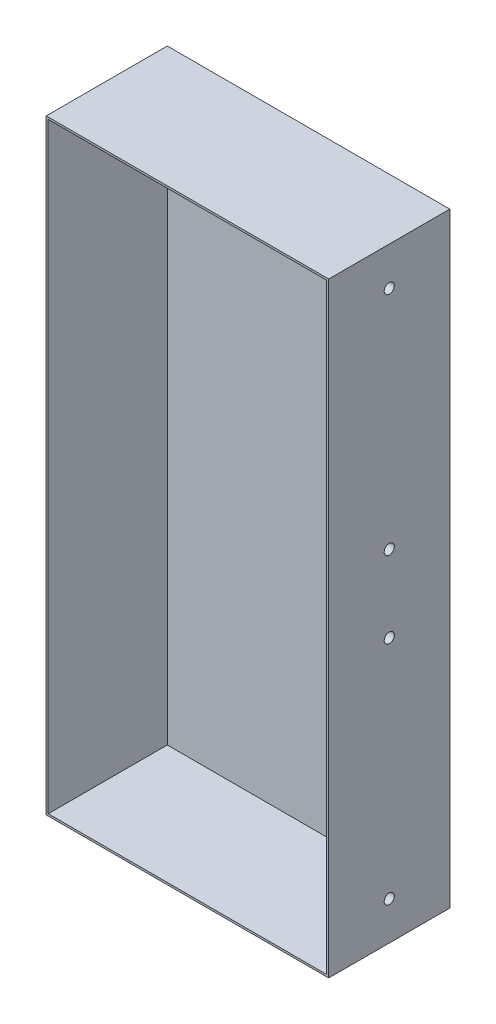
ISO-10303-21;
HEADER;
FILE_DESCRIPTION(('STEP AP214'),'2;1');
FILE_NAME('part.step','',(''),(''),'','','');
FILE_SCHEMA(('AUTOMOTIVE_DESIGN { 1 0 10303 214 1 1 1 1 }'));
ENDSEC;
DATA;
#1=APPLICATION_CONTEXT('core data for automotive mechanical design processes');
#2=APPLICATION_PROTOCOL_DEFINITION('international standard','automotive_design',2000,#1);
#3=PRODUCT_CONTEXT('',#1,'mechanical');
#4=PRODUCT('Part','Part','',(#3));
#5=PRODUCT_RELATED_PRODUCT_CATEGORY('part','',(#4));
#6=PRODUCT_DEFINITION_FORMATION('','',#4);
#7=PRODUCT_DEFINITION_CONTEXT('part definition',#1,'design');
#8=PRODUCT_DEFINITION('design','',#6,#7);
#9=PRODUCT_DEFINITION_SHAPE('','',#8);
#10=(LENGTH_UNIT() NAMED_UNIT(*) SI_UNIT(.MILLI.,.METRE.));
#11=(NAMED_UNIT(*) PLANE_ANGLE_UNIT() SI_UNIT($,.RADIAN.));
#12=(NAMED_UNIT(*) SI_UNIT($,.STERADIAN.) SOLID_ANGLE_UNIT());
#13=UNCERTAINTY_MEASURE_WITH_UNIT(LENGTH_MEASURE(1.E-05),#10,'distance_accuracy_value','');
#14=(GEOMETRIC_REPRESENTATION_CONTEXT(3) GLOBAL_UNCERTAINTY_ASSIGNED_CONTEXT((#13)) GLOBAL_UNIT_ASSIGNED_CONTEXT((#10,
#11,#12)) REPRESENTATION_CONTEXT('',''));
#15=CARTESIAN_POINT('',(0.,0.,0.));
#16=DIRECTION('',(0.,0.,1.));
#17=DIRECTION('',(1.,0.,0.));
#18=AXIS2_PLACEMENT_3D('',#15,#16,#17);
#19=CARTESIAN_POINT('',(0.,0.,150.));
#20=DIRECTION('',(0.,0.,-1.));
#21=DIRECTION('',(-1.,0.,0.));
#22=AXIS2_PLACEMENT_3D('',#19,#20,#21);
#23=PLANE('',#22);
#24=DIRECTION('',(-1.,0.,0.));
#25=VECTOR('',#24,1.);
#26=CARTESIAN_POINT('',(-350.,750.,150.));
#27=LINE('',#26,#25);
#28=CARTESIAN_POINT('',(350.,750.,150.));
#29=VERTEX_POINT('',#28);
#30=CARTESIAN_POINT('',(-350.,750.,150.));
#31=VERTEX_POINT('',#30);
#32=EDGE_CURVE('E183',#29,#31,#27,.T.);
#33=ORIENTED_EDGE('',*,*,#32,.T.);
#34=DIRECTION('',(0.,-1.,0.));
#35=VECTOR('',#34,1.);
#36=CARTESIAN_POINT('',(-350.,750.,150.));
#37=LINE('',#36,#35);
#38=CARTESIAN_POINT('',(-350.,-750.,150.));
#39=VERTEX_POINT('',#38);
#40=EDGE_CURVE('E185',#31,#39,#37,.T.);
#41=ORIENTED_EDGE('',*,*,#40,.T.);
#42=DIRECTION('',(1.,0.,0.));
#43=VECTOR('',#42,1.);
#44=CARTESIAN_POINT('',(-350.,-750.,150.));
#45=LINE('',#44,#43);
#46=CARTESIAN_POINT('',(350.,-750.,150.));
#47=VERTEX_POINT('',#46);
#48=EDGE_CURVE('E187',#39,#47,#45,.T.);
#49=ORIENTED_EDGE('',*,*,#48,.T.);
#50=DIRECTION('',(0.,1.,0.));
#51=VECTOR('',#50,1.);
#52=CARTESIAN_POINT('',(350.,750.,150.));
#53=LINE('',#52,#51);
#54=EDGE_CURVE('E55',#47,#29,#53,.T.);
#55=ORIENTED_EDGE('',*,*,#54,.T.);
#56=EDGE_LOOP('',(#33,#41,#49,#55));
#57=FACE_BOUND('',#56,.T.);
#58=DIRECTION('',(-1.,0.,0.));
#59=VECTOR('',#58,1.);
#60=CARTESIAN_POINT('',(0.,745.,150.));
#61=LINE('',#60,#59);
#62=CARTESIAN_POINT('',(345.,745.,150.));
#63=VERTEX_POINT('',#62);
#64=CARTESIAN_POINT('',(-345.,745.,150.));
#65=VERTEX_POINT('',#64);
#66=EDGE_CURVE('E120',#63,#65,#61,.T.);
#67=ORIENTED_EDGE('',*,*,#66,.F.);
#68=DIRECTION('',(0.,1.,0.));
#69=VECTOR('',#68,1.);
#70=CARTESIAN_POINT('',(345.,0.,150.));
#71=LINE('',#70,#69);
#72=CARTESIAN_POINT('',(345.,-745.,150.));
#73=VERTEX_POINT('',#72);
#74=EDGE_CURVE('E101',#73,#63,#71,.T.);
#75=ORIENTED_EDGE('',*,*,#74,.F.);
#76=DIRECTION('',(1.,0.,0.));
#77=VECTOR('',#76,1.);
#78=CARTESIAN_POINT('',(0.,-745.,150.));
#79=LINE('',#78,#77);
#80=CARTESIAN_POINT('',(-345.,-745.,150.));
#81=VERTEX_POINT('',#80);
#82=EDGE_CURVE('E130',#81,#73,#79,.T.);
#83=ORIENTED_EDGE('',*,*,#82,.F.);
#84=DIRECTION('',(0.,-1.,0.));
#85=VECTOR('',#84,1.);
#86=CARTESIAN_POINT('',(-345.,0.,150.));
#87=LINE('',#86,#85);
#88=EDGE_CURVE('E122',#65,#81,#87,.T.);
#89=ORIENTED_EDGE('',*,*,#88,.F.);
#90=EDGE_LOOP('',(#67,#75,#83,#89));
#91=FACE_BOUND('',#90,.T.);
#92=ADVANCED_FACE('F32',(#57,#91),#23,.F.);
#93=CARTESIAN_POINT('',(-350.,750.,150.));
#94=DIRECTION('',(0.,-1.,0.));
#95=DIRECTION('',(0.,0.,-1.));
#96=AXIS2_PLACEMENT_3D('',#93,#94,#95);
#97=PLANE('',#96);
#98=DIRECTION('',(0.,0.,-1.));
#99=VECTOR('',#98,1.);
#100=CARTESIAN_POINT('',(350.,750.,150.));
#101=LINE('',#100,#99);
#102=CARTESIAN_POINT('',(350.,750.,-150.));
#103=VERTEX_POINT('',#102);
#104=EDGE_CURVE('E190',#29,#103,#101,.T.);
#105=ORIENTED_EDGE('',*,*,#104,.T.);
#106=DIRECTION('',(-1.,0.,0.));
#107=VECTOR('',#106,1.);
#108=CARTESIAN_POINT('',(-350.,750.,-150.));
#109=LINE('',#108,#107);
#110=CARTESIAN_POINT('',(-350.,750.,-150.));
#111=VERTEX_POINT('',#110);
#112=EDGE_CURVE('E167',#103,#111,#109,.T.);
#113=ORIENTED_EDGE('',*,*,#112,.T.);
#114=DIRECTION('',(0.,0.,-1.));
#115=VECTOR('',#114,1.);
#116=CARTESIAN_POINT('',(-350.,750.,150.));
#117=LINE('',#116,#115);
#118=EDGE_CURVE('E11',#31,#111,#117,.T.);
#119=ORIENTED_EDGE('',*,*,#118,.F.);
#120=ORIENTED_EDGE('',*,*,#32,.F.);
#121=EDGE_LOOP('',(#105,#113,#119,#120));
#122=FACE_BOUND('',#121,.T.);
#123=ADVANCED_FACE('F34',(#122),#97,.F.);
#124=CARTESIAN_POINT('',(-350.,750.,150.));
#125=DIRECTION('',(1.,0.,0.));
#126=DIRECTION('',(0.,1.,0.));
#127=AXIS2_PLACEMENT_3D('',#124,#125,#126);
#128=PLANE('',#127);
#129=ORIENTED_EDGE('',*,*,#118,.T.);
#130=DIRECTION('',(0.,-1.,0.));
#131=VECTOR('',#130,1.);
#132=CARTESIAN_POINT('',(-350.,750.,-150.));
#133=LINE('',#132,#131);
#134=CARTESIAN_POINT('',(-350.,-750.,-150.));
#135=VERTEX_POINT('',#134);
#136=EDGE_CURVE('E174',#111,#135,#133,.T.);
#137=ORIENTED_EDGE('',*,*,#136,.T.);
#138=DIRECTION('',(0.,0.,-1.));
#139=VECTOR('',#138,1.);
#140=CARTESIAN_POINT('',(-350.,-750.,150.));
#141=LINE('',#140,#139);
#142=EDGE_CURVE('E40',#39,#135,#141,.T.);
#143=ORIENTED_EDGE('',*,*,#142,.F.);
#144=ORIENTED_EDGE('',*,*,#40,.F.);
#145=EDGE_LOOP('',(#129,#137,#143,#144));
#146=FACE_BOUND('',#145,.T.);
#147=ADVANCED_FACE('F205',(#146),#128,.F.);
#148=CARTESIAN_POINT('',(-350.,-750.,150.));
#149=DIRECTION('',(0.,1.,0.));
#150=DIRECTION('',(0.,0.,1.));
#151=AXIS2_PLACEMENT_3D('',#148,#149,#150);
#152=PLANE('',#151);
#153=ORIENTED_EDGE('',*,*,#142,.T.);
#154=DIRECTION('',(1.,0.,0.));
#155=VECTOR('',#154,1.);
#156=CARTESIAN_POINT('',(-350.,-750.,-150.));
#157=LINE('',#156,#155);
#158=CARTESIAN_POINT('',(350.,-750.,-150.));
#159=VERTEX_POINT('',#158);
#160=EDGE_CURVE('E177',#135,#159,#157,.T.);
#161=ORIENTED_EDGE('',*,*,#160,.T.);
#162=DIRECTION('',(0.,0.,-1.));
#163=VECTOR('',#162,1.);
#164=CARTESIAN_POINT('',(350.,-750.,150.));
#165=LINE('',#164,#163);
#166=EDGE_CURVE('E192',#47,#159,#165,.T.);
#167=ORIENTED_EDGE('',*,*,#166,.F.);
#168=ORIENTED_EDGE('',*,*,#48,.F.);
#169=EDGE_LOOP('',(#153,#161,#167,#168));
#170=FACE_BOUND('',#169,.T.);
#171=ADVANCED_FACE('F197',(#170),#152,.F.);
#172=CARTESIAN_POINT('',(350.,750.,150.));
#173=DIRECTION('',(-1.,0.,0.));
#174=DIRECTION('',(0.,-1.,0.));
#175=AXIS2_PLACEMENT_3D('',#172,#173,#174);
#176=PLANE('',#175);
#177=CARTESIAN_POINT('',(350.,-655.,0.));
#178=DIRECTION('',(-1.,0.,0.));
#179=DIRECTION('',(0.,-1.,0.));
#180=AXIS2_PLACEMENT_3D('',#177,#178,#179);
#181=CIRCLE('',#180,12.5);
#182=CARTESIAN_POINT('',(350.,-667.5,0.));
#183=VERTEX_POINT('',#182);
#184=EDGE_CURVE('E151',#183,#183,#181,.T.);
#185=ORIENTED_EDGE('',*,*,#184,.T.);
#186=EDGE_LOOP('',(#185));
#187=FACE_BOUND('',#186,.T.);
#188=CARTESIAN_POINT('',(350.,-95.0000000000002,-5.83139853888034E-12));
#189=DIRECTION('',(-1.,0.,0.));
#190=DIRECTION('',(0.,-1.,0.));
#191=AXIS2_PLACEMENT_3D('',#188,#189,#190);
#192=CIRCLE('',#191,12.5);
#193=CARTESIAN_POINT('',(350.,-107.5,-5.83139853888034E-12));
#194=VERTEX_POINT('',#193);
#195=EDGE_CURVE('E155',#194,#194,#192,.T.);
#196=ORIENTED_EDGE('',*,*,#195,.T.);
#197=EDGE_LOOP('',(#196));
#198=FACE_BOUND('',#197,.T.);
#199=CARTESIAN_POINT('',(350.,655.,0.));
#200=DIRECTION('',(1.,0.,0.));
#201=DIRECTION('',(0.,1.,0.));
#202=AXIS2_PLACEMENT_3D('',#199,#200,#201);
#203=CIRCLE('',#202,12.5);
#204=CARTESIAN_POINT('',(350.,667.5,0.));
#205=VERTEX_POINT('',#204);
#206=EDGE_CURVE('E164',#205,#205,#203,.T.);
#207=ORIENTED_EDGE('',*,*,#206,.F.);
#208=EDGE_LOOP('',(#207));
#209=FACE_BOUND('',#208,.T.);
#210=CARTESIAN_POINT('',(350.,95.0000000000002,-5.83139853888034E-12));
#211=DIRECTION('',(1.,0.,0.));
#212=DIRECTION('',(0.,1.,0.));
#213=AXIS2_PLACEMENT_3D('',#210,#211,#212);
#214=CIRCLE('',#213,12.5);
#215=CARTESIAN_POINT('',(350.,107.5,-5.83139853888034E-12));
#216=VERTEX_POINT('',#215);
#217=EDGE_CURVE('E154',#216,#216,#214,.T.);
#218=ORIENTED_EDGE('',*,*,#217,.F.);
#219=EDGE_LOOP('',(#218));
#220=FACE_BOUND('',#219,.T.);
#221=ORIENTED_EDGE('',*,*,#166,.T.);
#222=DIRECTION('',(0.,1.,0.));
#223=VECTOR('',#222,1.);
#224=CARTESIAN_POINT('',(350.,750.,-150.));
#225=LINE('',#224,#223);
#226=EDGE_CURVE('E180',#159,#103,#225,.T.);
#227=ORIENTED_EDGE('',*,*,#226,.T.);
#228=ORIENTED_EDGE('',*,*,#104,.F.);
#229=ORIENTED_EDGE('',*,*,#54,.F.);
#230=EDGE_LOOP('',(#221,#227,#228,#229));
#231=FACE_BOUND('',#230,.T.);
#232=ADVANCED_FACE('F210',(#187,#198,#209,#220,#231),#176,.F.);
#233=CARTESIAN_POINT('',(0.,0.,-150.));
#234=DIRECTION('',(0.,0.,-1.));
#235=DIRECTION('',(-1.,0.,0.));
#236=AXIS2_PLACEMENT_3D('',#233,#234,#235);
#237=PLANE('',#236);
#238=ORIENTED_EDGE('',*,*,#112,.F.);
#239=ORIENTED_EDGE('',*,*,#226,.F.);
#240=ORIENTED_EDGE('',*,*,#160,.F.);
#241=ORIENTED_EDGE('',*,*,#136,.F.);
#242=EDGE_LOOP('',(#238,#239,#240,#241));
#243=FACE_BOUND('',#242,.T.);
#244=ADVANCED_FACE('F204',(#243),#237,.T.);
#245=CARTESIAN_POINT('',(320.,95.0000000000002,-5.83139853888034E-12));
#246=DIRECTION('',(1.,0.,0.));
#247=DIRECTION('',(0.,1.,0.));
#248=AXIS2_PLACEMENT_3D('',#245,#246,#247);
#249=CYLINDRICAL_SURFACE('',#248,12.5);
#250=CARTESIAN_POINT('',(320.,95.0000000000002,-5.83139853888034E-12));
#251=DIRECTION('',(1.,0.,0.));
#252=DIRECTION('',(0.,1.,0.));
#253=AXIS2_PLACEMENT_3D('',#250,#251,#252);
#254=CIRCLE('',#253,12.5);
#255=CARTESIAN_POINT('',(320.,107.5,-5.83139853888034E-12));
#256=VERTEX_POINT('',#255);
#257=EDGE_CURVE('E161',#256,#256,#254,.T.);
#258=ORIENTED_EDGE('',*,*,#257,.F.);
#259=EDGE_LOOP('',(#258));
#260=FACE_BOUND('',#259,.T.);
#261=ORIENTED_EDGE('',*,*,#217,.T.);
#262=EDGE_LOOP('',(#261));
#263=FACE_BOUND('',#262,.T.);
#264=ADVANCED_FACE('F218',(#260,#263),#249,.F.);
#265=CARTESIAN_POINT('',(320.,655.,0.));
#266=DIRECTION('',(1.,0.,0.));
#267=DIRECTION('',(0.,1.,0.));
#268=AXIS2_PLACEMENT_3D('',#265,#266,#267);
#269=CYLINDRICAL_SURFACE('',#268,12.5);
#270=CARTESIAN_POINT('',(320.,655.,0.));
#271=DIRECTION('',(1.,0.,0.));
#272=DIRECTION('',(0.,1.,0.));
#273=AXIS2_PLACEMENT_3D('',#270,#271,#272);
#274=CIRCLE('',#273,12.5);
#275=CARTESIAN_POINT('',(320.,667.5,0.));
#276=VERTEX_POINT('',#275);
#277=EDGE_CURVE('E158',#276,#276,#274,.T.);
#278=ORIENTED_EDGE('',*,*,#277,.F.);
#279=EDGE_LOOP('',(#278));
#280=FACE_BOUND('',#279,.T.);
#281=ORIENTED_EDGE('',*,*,#206,.T.);
#282=EDGE_LOOP('',(#281));
#283=FACE_BOUND('',#282,.T.);
#284=ADVANCED_FACE('F231',(#280,#283),#269,.F.);
#285=CARTESIAN_POINT('',(320.,-95.0000000000002,-5.83139853888034E-12));
#286=DIRECTION('',(1.,0.,0.));
#287=DIRECTION('',(0.,1.,0.));
#288=AXIS2_PLACEMENT_3D('',#285,#286,#287);
#289=CYLINDRICAL_SURFACE('',#288,12.5);
#290=CARTESIAN_POINT('',(320.,-95.0000000000002,-5.83139853888034E-12));
#291=DIRECTION('',(-1.,0.,0.));
#292=DIRECTION('',(0.,-1.,0.));
#293=AXIS2_PLACEMENT_3D('',#290,#291,#292);
#294=CIRCLE('',#293,12.5);
#295=CARTESIAN_POINT('',(320.,-107.5,-5.83139853888034E-12));
#296=VERTEX_POINT('',#295);
#297=EDGE_CURVE('E150',#296,#296,#294,.T.);
#298=ORIENTED_EDGE('',*,*,#297,.T.);
#299=EDGE_LOOP('',(#298));
#300=FACE_BOUND('',#299,.T.);
#301=ORIENTED_EDGE('',*,*,#195,.F.);
#302=EDGE_LOOP('',(#301));
#303=FACE_BOUND('',#302,.T.);
#304=ADVANCED_FACE('F235',(#300,#303),#289,.F.);
#305=CARTESIAN_POINT('',(320.,-655.,0.));
#306=DIRECTION('',(1.,0.,0.));
#307=DIRECTION('',(0.,1.,0.));
#308=AXIS2_PLACEMENT_3D('',#305,#306,#307);
#309=CYLINDRICAL_SURFACE('',#308,12.5);
#310=CARTESIAN_POINT('',(320.,-655.,0.));
#311=DIRECTION('',(-1.,0.,0.));
#312=DIRECTION('',(0.,-1.,0.));
#313=AXIS2_PLACEMENT_3D('',#310,#311,#312);
#314=CIRCLE('',#313,12.5);
#315=CARTESIAN_POINT('',(320.,-667.5,0.));
#316=VERTEX_POINT('',#315);
#317=EDGE_CURVE('E147',#316,#316,#314,.T.);
#318=ORIENTED_EDGE('',*,*,#317,.T.);
#319=EDGE_LOOP('',(#318));
#320=FACE_BOUND('',#319,.T.);
#321=ORIENTED_EDGE('',*,*,#184,.F.);
#322=EDGE_LOOP('',(#321));
#323=FACE_BOUND('',#322,.T.);
#324=ADVANCED_FACE('F239',(#320,#323),#309,.F.);
#325=CARTESIAN_POINT('',(320.,-95.0000000000002,-5.83139853888034E-12));
#326=DIRECTION('',(1.,0.,0.));
#327=DIRECTION('',(0.,-1.,0.));
#328=AXIS2_PLACEMENT_3D('',#325,#326,#327);
#329=PLANE('',#328);
#330=CARTESIAN_POINT('',(320.,-95.0000000000002,-5.83139853888034E-12));
#331=DIRECTION('',(1.,0.,0.));
#332=DIRECTION('',(0.,1.,0.));
#333=AXIS2_PLACEMENT_3D('',#330,#331,#332);
#334=CIRCLE('',#333,17.5);
#335=CARTESIAN_POINT('',(320.,-77.5000000000002,-5.83139853888034E-12));
#336=VERTEX_POINT('',#335);
#337=EDGE_CURVE('E139',#336,#336,#334,.F.);
#338=ORIENTED_EDGE('',*,*,#337,.T.);
#339=EDGE_LOOP('',(#338));
#340=FACE_BOUND('',#339,.T.);
#341=ORIENTED_EDGE('',*,*,#297,.F.);
#342=EDGE_LOOP('',(#341));
#343=FACE_BOUND('',#342,.T.);
#344=ADVANCED_FACE('F243',(#340,#343),#329,.F.);
#345=CARTESIAN_POINT('',(320.,-655.,0.));
#346=DIRECTION('',(1.,0.,0.));
#347=DIRECTION('',(0.,-1.,0.));
#348=AXIS2_PLACEMENT_3D('',#345,#346,#347);
#349=PLANE('',#348);
#350=CARTESIAN_POINT('',(320.,-655.,0.));
#351=DIRECTION('',(1.,0.,0.));
#352=DIRECTION('',(0.,1.,0.));
#353=AXIS2_PLACEMENT_3D('',#350,#351,#352);
#354=CIRCLE('',#353,17.5);
#355=CARTESIAN_POINT('',(320.,-637.5,0.));
#356=VERTEX_POINT('',#355);
#357=EDGE_CURVE('E144',#356,#356,#354,.F.);
#358=ORIENTED_EDGE('',*,*,#357,.T.);
#359=EDGE_LOOP('',(#358));
#360=FACE_BOUND('',#359,.T.);
#361=ORIENTED_EDGE('',*,*,#317,.F.);
#362=EDGE_LOOP('',(#361));
#363=FACE_BOUND('',#362,.T.);
#364=ADVANCED_FACE('F278',(#360,#363),#349,.F.);
#365=CARTESIAN_POINT('',(-350.,745.,150.));
#366=DIRECTION('',(0.,-1.,0.));
#367=DIRECTION('',(0.,0.,-1.));
#368=AXIS2_PLACEMENT_3D('',#365,#366,#367);
#369=PLANE('',#368);
#370=DIRECTION('',(0.,0.,-1.));
#371=VECTOR('',#370,1.);
#372=CARTESIAN_POINT('',(345.,745.,150.));
#373=LINE('',#372,#371);
#374=CARTESIAN_POINT('',(345.,745.,-145.));
#375=VERTEX_POINT('',#374);
#376=EDGE_CURVE('E95',#63,#375,#373,.T.);
#377=ORIENTED_EDGE('',*,*,#376,.F.);
#378=ORIENTED_EDGE('',*,*,#66,.T.);
#379=DIRECTION('',(0.,0.,-1.));
#380=VECTOR('',#379,1.);
#381=CARTESIAN_POINT('',(-345.,745.,150.));
#382=LINE('',#381,#380);
#383=CARTESIAN_POINT('',(-345.,745.,-145.));
#384=VERTEX_POINT('',#383);
#385=EDGE_CURVE('E109',#65,#384,#382,.T.);
#386=ORIENTED_EDGE('',*,*,#385,.T.);
#387=DIRECTION('',(-1.,0.,0.));
#388=VECTOR('',#387,1.);
#389=CARTESIAN_POINT('',(0.,745.,-145.));
#390=LINE('',#389,#388);
#391=EDGE_CURVE('E106',#375,#384,#390,.T.);
#392=ORIENTED_EDGE('',*,*,#391,.F.);
#393=EDGE_LOOP('',(#377,#378,#386,#392));
#394=FACE_BOUND('',#393,.T.);
#395=ADVANCED_FACE('F107',(#394),#369,.T.);
#396=CARTESIAN_POINT('',(-345.,750.,150.));
#397=DIRECTION('',(1.,0.,0.));
#398=DIRECTION('',(0.,1.,0.));
#399=AXIS2_PLACEMENT_3D('',#396,#397,#398);
#400=PLANE('',#399);
#401=ORIENTED_EDGE('',*,*,#385,.F.);
#402=ORIENTED_EDGE('',*,*,#88,.T.);
#403=DIRECTION('',(0.,0.,-1.));
#404=VECTOR('',#403,1.);
#405=CARTESIAN_POINT('',(-345.,-745.,150.));
#406=LINE('',#405,#404);
#407=CARTESIAN_POINT('',(-345.,-745.,-145.));
#408=VERTEX_POINT('',#407);
#409=EDGE_CURVE('E315',#81,#408,#406,.T.);
#410=ORIENTED_EDGE('',*,*,#409,.T.);
#411=DIRECTION('',(0.,-1.,0.));
#412=VECTOR('',#411,1.);
#413=CARTESIAN_POINT('',(-345.,0.,-145.));
#414=LINE('',#413,#412);
#415=EDGE_CURVE('E113',#384,#408,#414,.T.);
#416=ORIENTED_EDGE('',*,*,#415,.F.);
#417=EDGE_LOOP('',(#401,#402,#410,#416));
#418=FACE_BOUND('',#417,.T.);
#419=ADVANCED_FACE('F271',(#418),#400,.T.);
#420=CARTESIAN_POINT('',(-350.,-745.,150.));
#421=DIRECTION('',(0.,1.,0.));
#422=DIRECTION('',(0.,0.,1.));
#423=AXIS2_PLACEMENT_3D('',#420,#421,#422);
#424=PLANE('',#423);
#425=ORIENTED_EDGE('',*,*,#409,.F.);
#426=ORIENTED_EDGE('',*,*,#82,.T.);
#427=DIRECTION('',(0.,0.,-1.));
#428=VECTOR('',#427,1.);
#429=CARTESIAN_POINT('',(345.,-745.,150.));
#430=LINE('',#429,#428);
#431=CARTESIAN_POINT('',(345.,-745.,-145.));
#432=VERTEX_POINT('',#431);
#433=EDGE_CURVE('E47',#73,#432,#430,.T.);
#434=ORIENTED_EDGE('',*,*,#433,.T.);
#435=DIRECTION('',(1.,0.,0.));
#436=VECTOR('',#435,1.);
#437=CARTESIAN_POINT('',(0.,-745.,-145.));
#438=LINE('',#437,#436);
#439=EDGE_CURVE('E119',#408,#432,#438,.T.);
#440=ORIENTED_EDGE('',*,*,#439,.F.);
#441=EDGE_LOOP('',(#425,#426,#434,#440));
#442=FACE_BOUND('',#441,.T.);
#443=ADVANCED_FACE('F267',(#442),#424,.T.);
#444=CARTESIAN_POINT('',(345.,750.,150.));
#445=DIRECTION('',(-1.,0.,0.));
#446=DIRECTION('',(0.,-1.,0.));
#447=AXIS2_PLACEMENT_3D('',#444,#445,#446);
#448=PLANE('',#447);
#449=CARTESIAN_POINT('',(345.,-655.,0.));
#450=DIRECTION('',(-1.,0.,0.));
#451=DIRECTION('',(0.,-1.,0.));
#452=AXIS2_PLACEMENT_3D('',#449,#450,#451);
#453=CIRCLE('',#452,17.5);
#454=CARTESIAN_POINT('',(345.,-672.5,0.));
#455=VERTEX_POINT('',#454);
#456=EDGE_CURVE('E142',#455,#455,#453,.T.);
#457=ORIENTED_EDGE('',*,*,#456,.F.);
#458=EDGE_LOOP('',(#457));
#459=FACE_BOUND('',#458,.T.);
#460=CARTESIAN_POINT('',(345.,-95.0000000000002,-5.83139853888034E-12));
#461=DIRECTION('',(-1.,0.,0.));
#462=DIRECTION('',(0.,-1.,0.));
#463=AXIS2_PLACEMENT_3D('',#460,#461,#462);
#464=CIRCLE('',#463,17.5);
#465=CARTESIAN_POINT('',(345.,-112.5,-5.83139853888034E-12));
#466=VERTEX_POINT('',#465);
#467=EDGE_CURVE('E143',#466,#466,#464,.T.);
#468=ORIENTED_EDGE('',*,*,#467,.F.);
#469=EDGE_LOOP('',(#468));
#470=FACE_BOUND('',#469,.T.);
#471=CARTESIAN_POINT('',(345.,655.,0.));
#472=DIRECTION('',(-1.,0.,0.));
#473=DIRECTION('',(0.,-1.,0.));
#474=AXIS2_PLACEMENT_3D('',#471,#472,#473);
#475=CIRCLE('',#474,17.5);
#476=CARTESIAN_POINT('',(345.,637.5,0.));
#477=VERTEX_POINT('',#476);
#478=EDGE_CURVE('E136',#477,#477,#475,.F.);
#479=ORIENTED_EDGE('',*,*,#478,.T.);
#480=EDGE_LOOP('',(#479));
#481=FACE_BOUND('',#480,.T.);
#482=CARTESIAN_POINT('',(345.,95.0000000000002,-5.83139853888034E-12));
#483=DIRECTION('',(-1.,0.,0.));
#484=DIRECTION('',(0.,-1.,0.));
#485=AXIS2_PLACEMENT_3D('',#482,#483,#484);
#486=CIRCLE('',#485,17.5);
#487=CARTESIAN_POINT('',(345.,77.5000000000002,-5.83139853888034E-12));
#488=VERTEX_POINT('',#487);
#489=EDGE_CURVE('E126',#488,#488,#486,.F.);
#490=ORIENTED_EDGE('',*,*,#489,.T.);
#491=EDGE_LOOP('',(#490));
#492=FACE_BOUND('',#491,.T.);
#493=ORIENTED_EDGE('',*,*,#433,.F.);
#494=ORIENTED_EDGE('',*,*,#74,.T.);
#495=ORIENTED_EDGE('',*,*,#376,.T.);
#496=DIRECTION('',(0.,1.,0.));
#497=VECTOR('',#496,1.);
#498=CARTESIAN_POINT('',(345.,0.,-145.));
#499=LINE('',#498,#497);
#500=EDGE_CURVE('E99',#432,#375,#499,.T.);
#501=ORIENTED_EDGE('',*,*,#500,.F.);
#502=EDGE_LOOP('',(#493,#494,#495,#501));
#503=FACE_BOUND('',#502,.T.);
#504=ADVANCED_FACE('F97',(#459,#470,#481,#492,#503),#448,.T.);
#505=CARTESIAN_POINT('',(0.,0.,-145.));
#506=DIRECTION('',(0.,0.,-1.));
#507=DIRECTION('',(-1.,0.,0.));
#508=AXIS2_PLACEMENT_3D('',#505,#506,#507);
#509=PLANE('',#508);
#510=ORIENTED_EDGE('',*,*,#391,.T.);
#511=ORIENTED_EDGE('',*,*,#415,.T.);
#512=ORIENTED_EDGE('',*,*,#439,.T.);
#513=ORIENTED_EDGE('',*,*,#500,.T.);
#514=EDGE_LOOP('',(#510,#511,#512,#513));
#515=FACE_BOUND('',#514,.T.);
#516=ADVANCED_FACE('F117',(#515),#509,.F.);
#517=CARTESIAN_POINT('',(320.,95.0000000000002,-5.83139853888034E-12));
#518=DIRECTION('',(1.,0.,0.));
#519=DIRECTION('',(0.,1.,0.));
#520=AXIS2_PLACEMENT_3D('',#517,#518,#519);
#521=CYLINDRICAL_SURFACE('',#520,17.5);
#522=CARTESIAN_POINT('',(320.,95.0000000000002,-5.83139853888034E-12));
#523=DIRECTION('',(1.,0.,0.));
#524=DIRECTION('',(0.,1.,0.));
#525=AXIS2_PLACEMENT_3D('',#522,#523,#524);
#526=CIRCLE('',#525,17.5);
#527=CARTESIAN_POINT('',(320.,112.5,-5.83139853888034E-12));
#528=VERTEX_POINT('',#527);
#529=EDGE_CURVE('E133',#528,#528,#526,.T.);
#530=ORIENTED_EDGE('',*,*,#529,.T.);
#531=EDGE_LOOP('',(#530));
#532=FACE_BOUND('',#531,.T.);
#533=ORIENTED_EDGE('',*,*,#489,.F.);
#534=EDGE_LOOP('',(#533));
#535=FACE_BOUND('',#534,.T.);
#536=ADVANCED_FACE('F259',(#532,#535),#521,.T.);
#537=CARTESIAN_POINT('',(320.,95.0000000000002,-5.83139853888034E-12));
#538=DIRECTION('',(1.,0.,0.));
#539=DIRECTION('',(0.,1.,0.));
#540=AXIS2_PLACEMENT_3D('',#537,#538,#539);
#541=PLANE('',#540);
#542=ORIENTED_EDGE('',*,*,#257,.T.);
#543=EDGE_LOOP('',(#542));
#544=FACE_BOUND('',#543,.T.);
#545=ORIENTED_EDGE('',*,*,#529,.F.);
#546=EDGE_LOOP('',(#545));
#547=FACE_BOUND('',#546,.T.);
#548=ADVANCED_FACE('F257',(#544,#547),#541,.F.);
#549=CARTESIAN_POINT('',(320.,655.,0.));
#550=DIRECTION('',(1.,0.,0.));
#551=DIRECTION('',(0.,1.,0.));
#552=AXIS2_PLACEMENT_3D('',#549,#550,#551);
#553=CYLINDRICAL_SURFACE('',#552,17.5);
#554=CARTESIAN_POINT('',(320.,655.,0.));
#555=DIRECTION('',(1.,0.,0.));
#556=DIRECTION('',(0.,1.,0.));
#557=AXIS2_PLACEMENT_3D('',#554,#555,#556);
#558=CIRCLE('',#557,17.5);
#559=CARTESIAN_POINT('',(320.,672.5,0.));
#560=VERTEX_POINT('',#559);
#561=EDGE_CURVE('E114',#560,#560,#558,.T.);
#562=ORIENTED_EDGE('',*,*,#561,.T.);
#563=EDGE_LOOP('',(#562));
#564=FACE_BOUND('',#563,.T.);
#565=ORIENTED_EDGE('',*,*,#478,.F.);
#566=EDGE_LOOP('',(#565));
#567=FACE_BOUND('',#566,.T.);
#568=ADVANCED_FACE('F254',(#564,#567),#553,.T.);
#569=CARTESIAN_POINT('',(320.,655.,0.));
#570=DIRECTION('',(1.,0.,0.));
#571=DIRECTION('',(0.,1.,0.));
#572=AXIS2_PLACEMENT_3D('',#569,#570,#571);
#573=PLANE('',#572);
#574=ORIENTED_EDGE('',*,*,#277,.T.);
#575=EDGE_LOOP('',(#574));
#576=FACE_BOUND('',#575,.T.);
#577=ORIENTED_EDGE('',*,*,#561,.F.);
#578=EDGE_LOOP('',(#577));
#579=FACE_BOUND('',#578,.T.);
#580=ADVANCED_FACE('F252',(#576,#579),#573,.F.);
#581=CARTESIAN_POINT('',(320.,-95.0000000000002,-5.83139853888034E-12));
#582=DIRECTION('',(1.,0.,0.));
#583=DIRECTION('',(0.,1.,0.));
#584=AXIS2_PLACEMENT_3D('',#581,#582,#583);
#585=CYLINDRICAL_SURFACE('',#584,17.5);
#586=ORIENTED_EDGE('',*,*,#337,.F.);
#587=EDGE_LOOP('',(#586));
#588=FACE_BOUND('',#587,.T.);
#589=ORIENTED_EDGE('',*,*,#467,.T.);
#590=EDGE_LOOP('',(#589));
#591=FACE_BOUND('',#590,.T.);
#592=ADVANCED_FACE('F248',(#588,#591),#585,.T.);
#593=CARTESIAN_POINT('',(320.,-655.,0.));
#594=DIRECTION('',(1.,0.,0.));
#595=DIRECTION('',(0.,1.,0.));
#596=AXIS2_PLACEMENT_3D('',#593,#594,#595);
#597=CYLINDRICAL_SURFACE('',#596,17.5);
#598=ORIENTED_EDGE('',*,*,#357,.F.);
#599=EDGE_LOOP('',(#598));
#600=FACE_BOUND('',#599,.T.);
#601=ORIENTED_EDGE('',*,*,#456,.T.);
#602=EDGE_LOOP('',(#601));
#603=FACE_BOUND('',#602,.T.);
#604=ADVANCED_FACE('F245',(#600,#603),#597,.T.);
#605=CLOSED_SHELL('',(#92,#123,#147,#171,#232,#244,#264,#284,#304,#324,#344,#364,#395,#419,#443,
#504,#516,#536,#548,#568,#580,#592,#604));
#606=MANIFOLD_SOLID_BREP('B2',#605);
#607=ADVANCED_BREP_SHAPE_REPRESENTATION('',(#18,#606),#14);
#608=SHAPE_DEFINITION_REPRESENTATION(#9,#607);
ENDSEC;
END-ISO-10303-21;
